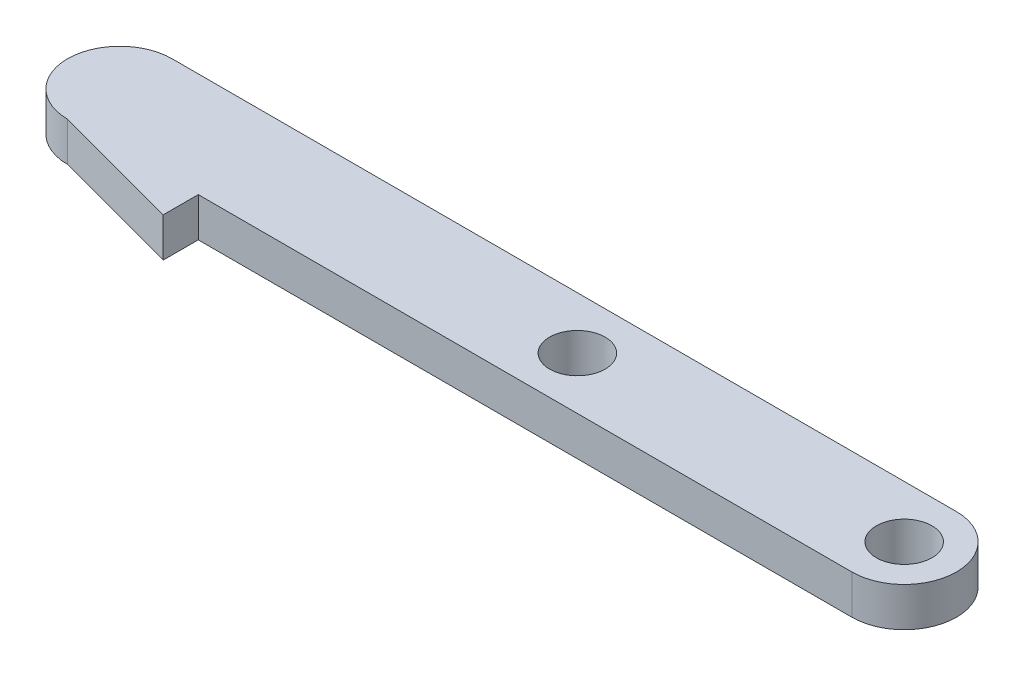
ISO-10303-21;
HEADER;
FILE_DESCRIPTION(('STEP AP214'),'2;1');
FILE_NAME('part.step','',(''),(''),'','','');
FILE_SCHEMA(('AUTOMOTIVE_DESIGN { 1 0 10303 214 1 1 1 1 }'));
ENDSEC;
DATA;
#1=APPLICATION_CONTEXT('core data for automotive mechanical design processes');
#2=APPLICATION_PROTOCOL_DEFINITION('international standard','automotive_design',2000,#1);
#3=PRODUCT_CONTEXT('',#1,'mechanical');
#4=PRODUCT('Part','Part','',(#3));
#5=PRODUCT_RELATED_PRODUCT_CATEGORY('part','',(#4));
#6=PRODUCT_DEFINITION_FORMATION('','',#4);
#7=PRODUCT_DEFINITION_CONTEXT('part definition',#1,'design');
#8=PRODUCT_DEFINITION('design','',#6,#7);
#9=PRODUCT_DEFINITION_SHAPE('','',#8);
#10=(LENGTH_UNIT() NAMED_UNIT(*) SI_UNIT(.MILLI.,.METRE.));
#11=(NAMED_UNIT(*) PLANE_ANGLE_UNIT() SI_UNIT($,.RADIAN.));
#12=(NAMED_UNIT(*) SI_UNIT($,.STERADIAN.) SOLID_ANGLE_UNIT());
#13=UNCERTAINTY_MEASURE_WITH_UNIT(LENGTH_MEASURE(1.E-05),#10,'distance_accuracy_value','');
#14=(GEOMETRIC_REPRESENTATION_CONTEXT(3) GLOBAL_UNCERTAINTY_ASSIGNED_CONTEXT((#13)) GLOBAL_UNIT_ASSIGNED_CONTEXT((#10,
#11,#12)) REPRESENTATION_CONTEXT('',''));
#15=CARTESIAN_POINT('',(0.,0.,0.));
#16=DIRECTION('',(0.,0.,1.));
#17=DIRECTION('',(1.,0.,0.));
#18=AXIS2_PLACEMENT_3D('',#15,#16,#17);
#19=CARTESIAN_POINT('',(-30.,3.,0.));
#20=DIRECTION('',(0.,1.,0.));
#21=DIRECTION('',(0.,0.,1.));
#22=AXIS2_PLACEMENT_3D('',#19,#20,#21);
#23=PLANE('',#22);
#24=CARTESIAN_POINT('',(30.,3.,0.));
#25=DIRECTION('',(0.,1.,0.));
#26=DIRECTION('',(0.,0.,1.));
#27=AXIS2_PLACEMENT_3D('',#24,#25,#26);
#28=CIRCLE('',#27,2.125);
#29=CARTESIAN_POINT('',(30.,3.,2.12499999999999));
#30=VERTEX_POINT('',#29);
#31=EDGE_CURVE('E124',#30,#30,#28,.T.);
#32=ORIENTED_EDGE('',*,*,#31,.F.);
#33=EDGE_LOOP('',(#32));
#34=FACE_BOUND('',#33,.T.);
#35=CARTESIAN_POINT('',(-30.,3.,0.));
#36=DIRECTION('',(0.,1.,0.));
#37=DIRECTION('',(0.,0.,1.));
#38=AXIS2_PLACEMENT_3D('',#35,#36,#37);
#39=CIRCLE('',#38,4.);
#40=CARTESIAN_POINT('',(-30.,3.,-4.));
#41=VERTEX_POINT('',#40);
#42=CARTESIAN_POINT('',(-30.,3.,4.));
#43=VERTEX_POINT('',#42);
#44=EDGE_CURVE('E82',#41,#43,#39,.T.);
#45=ORIENTED_EDGE('',*,*,#44,.T.);
#46=DIRECTION('',(-0.96592582628907,0.,-0.258819045102515));
#47=VECTOR('',#46,1.);
#48=CARTESIAN_POINT('',(-30.,3.,4.));
#49=LINE('',#48,#47);
#50=CARTESIAN_POINT('',(-20.,3.,6.67949192431116));
#51=VERTEX_POINT('',#50);
#52=EDGE_CURVE('E98',#51,#43,#49,.T.);
#53=ORIENTED_EDGE('',*,*,#52,.F.);
#54=DIRECTION('',(0.,0.,1.));
#55=VECTOR('',#54,1.);
#56=CARTESIAN_POINT('',(-20.,3.,6.67949192431116));
#57=LINE('',#56,#55);
#58=CARTESIAN_POINT('',(-20.,3.,4.));
#59=VERTEX_POINT('',#58);
#60=EDGE_CURVE('E108',#59,#51,#57,.T.);
#61=ORIENTED_EDGE('',*,*,#60,.F.);
#62=DIRECTION('',(1.,0.,0.));
#63=VECTOR('',#62,1.);
#64=CARTESIAN_POINT('',(-30.,3.,4.));
#65=LINE('',#64,#63);
#66=CARTESIAN_POINT('',(30.,3.,3.99999999999999));
#67=VERTEX_POINT('',#66);
#68=EDGE_CURVE('E47',#59,#67,#65,.T.);
#69=ORIENTED_EDGE('',*,*,#68,.T.);
#70=CARTESIAN_POINT('',(30.,3.,0.));
#71=DIRECTION('',(0.,1.,0.));
#72=DIRECTION('',(0.,0.,1.));
#73=AXIS2_PLACEMENT_3D('',#70,#71,#72);
#74=CIRCLE('',#73,4.);
#75=CARTESIAN_POINT('',(30.,3.,-4.00000000000001));
#76=VERTEX_POINT('',#75);
#77=EDGE_CURVE('E132',#67,#76,#74,.T.);
#78=ORIENTED_EDGE('',*,*,#77,.T.);
#79=DIRECTION('',(-1.,0.,0.));
#80=VECTOR('',#79,1.);
#81=CARTESIAN_POINT('',(-30.,3.,-4.));
#82=LINE('',#81,#80);
#83=EDGE_CURVE('E56',#76,#41,#82,.T.);
#84=ORIENTED_EDGE('',*,*,#83,.T.);
#85=EDGE_LOOP('',(#45,#53,#61,#69,#78,#84));
#86=FACE_BOUND('',#85,.T.);
#87=CARTESIAN_POINT('',(5.,3.,0.));
#88=DIRECTION('',(0.,1.,0.));
#89=DIRECTION('',(0.,0.,1.));
#90=AXIS2_PLACEMENT_3D('',#87,#88,#89);
#91=CIRCLE('',#90,2.125);
#92=CARTESIAN_POINT('',(5.,3.,2.125));
#93=VERTEX_POINT('',#92);
#94=EDGE_CURVE('E118',#93,#93,#91,.T.);
#95=ORIENTED_EDGE('',*,*,#94,.F.);
#96=EDGE_LOOP('',(#95));
#97=FACE_BOUND('',#96,.T.);
#98=ADVANCED_FACE('F32',(#34,#86,#97),#23,.T.);
#99=CARTESIAN_POINT('',(-30.,0.,0.));
#100=DIRECTION('',(0.,1.,0.));
#101=DIRECTION('',(0.,0.,1.));
#102=AXIS2_PLACEMENT_3D('',#99,#100,#101);
#103=PLANE('',#102);
#104=CARTESIAN_POINT('',(-30.,0.,0.));
#105=DIRECTION('',(0.,1.,0.));
#106=DIRECTION('',(0.,0.,1.));
#107=AXIS2_PLACEMENT_3D('',#104,#105,#106);
#108=CIRCLE('',#107,4.);
#109=CARTESIAN_POINT('',(-30.,0.,-4.));
#110=VERTEX_POINT('',#109);
#111=CARTESIAN_POINT('',(-30.,0.,4.));
#112=VERTEX_POINT('',#111);
#113=EDGE_CURVE('E127',#110,#112,#108,.T.);
#114=ORIENTED_EDGE('',*,*,#113,.F.);
#115=DIRECTION('',(-1.,0.,0.));
#116=VECTOR('',#115,1.);
#117=CARTESIAN_POINT('',(-30.,0.,-4.));
#118=LINE('',#117,#116);
#119=CARTESIAN_POINT('',(30.,0.,-4.00000000000001));
#120=VERTEX_POINT('',#119);
#121=EDGE_CURVE('E77',#120,#110,#118,.T.);
#122=ORIENTED_EDGE('',*,*,#121,.F.);
#123=CARTESIAN_POINT('',(30.,0.,0.));
#124=DIRECTION('',(0.,1.,0.));
#125=DIRECTION('',(0.,0.,1.));
#126=AXIS2_PLACEMENT_3D('',#123,#124,#125);
#127=CIRCLE('',#126,4.);
#128=CARTESIAN_POINT('',(30.,0.,3.99999999999999));
#129=VERTEX_POINT('',#128);
#130=EDGE_CURVE('E139',#129,#120,#127,.T.);
#131=ORIENTED_EDGE('',*,*,#130,.F.);
#132=DIRECTION('',(1.,0.,0.));
#133=VECTOR('',#132,1.);
#134=CARTESIAN_POINT('',(-30.,0.,4.));
#135=LINE('',#134,#133);
#136=CARTESIAN_POINT('',(-20.,0.,4.));
#137=VERTEX_POINT('',#136);
#138=EDGE_CURVE('E137',#137,#129,#135,.T.);
#139=ORIENTED_EDGE('',*,*,#138,.F.);
#140=DIRECTION('',(0.,0.,1.));
#141=VECTOR('',#140,1.);
#142=CARTESIAN_POINT('',(-20.,0.,6.67949192431116));
#143=LINE('',#142,#141);
#144=CARTESIAN_POINT('',(-20.,0.,6.67949192431116));
#145=VERTEX_POINT('',#144);
#146=EDGE_CURVE('E115',#137,#145,#143,.T.);
#147=ORIENTED_EDGE('',*,*,#146,.T.);
#148=DIRECTION('',(-0.96592582628907,0.,-0.258819045102515));
#149=VECTOR('',#148,1.);
#150=CARTESIAN_POINT('',(-30.,0.,4.));
#151=LINE('',#150,#149);
#152=EDGE_CURVE('E100',#145,#112,#151,.T.);
#153=ORIENTED_EDGE('',*,*,#152,.T.);
#154=EDGE_LOOP('',(#114,#122,#131,#139,#147,#153));
#155=FACE_BOUND('',#154,.T.);
#156=CARTESIAN_POINT('',(30.,0.,0.));
#157=DIRECTION('',(0.,1.,0.));
#158=DIRECTION('',(0.,0.,1.));
#159=AXIS2_PLACEMENT_3D('',#156,#157,#158);
#160=CIRCLE('',#159,2.125);
#161=CARTESIAN_POINT('',(30.,0.,2.12499999999999));
#162=VERTEX_POINT('',#161);
#163=EDGE_CURVE('E121',#162,#162,#160,.T.);
#164=ORIENTED_EDGE('',*,*,#163,.T.);
#165=EDGE_LOOP('',(#164));
#166=FACE_BOUND('',#165,.T.);
#167=CARTESIAN_POINT('',(5.,0.,0.));
#168=DIRECTION('',(0.,1.,0.));
#169=DIRECTION('',(0.,0.,1.));
#170=AXIS2_PLACEMENT_3D('',#167,#168,#169);
#171=CIRCLE('',#170,2.125);
#172=CARTESIAN_POINT('',(5.,0.,2.125));
#173=VERTEX_POINT('',#172);
#174=EDGE_CURVE('E104',#173,#173,#171,.T.);
#175=ORIENTED_EDGE('',*,*,#174,.T.);
#176=EDGE_LOOP('',(#175));
#177=FACE_BOUND('',#176,.T.);
#178=ADVANCED_FACE('F152',(#155,#166,#177),#103,.F.);
#179=CARTESIAN_POINT('',(-30.,3.,0.));
#180=DIRECTION('',(0.,-1.,0.));
#181=DIRECTION('',(0.,0.,-1.));
#182=AXIS2_PLACEMENT_3D('',#179,#180,#181);
#183=CYLINDRICAL_SURFACE('',#182,4.);
#184=ORIENTED_EDGE('',*,*,#113,.T.);
#185=DIRECTION('',(0.,-1.,0.));
#186=VECTOR('',#185,1.);
#187=CARTESIAN_POINT('',(-30.,3.,4.));
#188=LINE('',#187,#186);
#189=EDGE_CURVE('E11',#43,#112,#188,.T.);
#190=ORIENTED_EDGE('',*,*,#189,.F.);
#191=ORIENTED_EDGE('',*,*,#44,.F.);
#192=DIRECTION('',(0.,-1.,0.));
#193=VECTOR('',#192,1.);
#194=CARTESIAN_POINT('',(-30.,3.,-4.));
#195=LINE('',#194,#193);
#196=EDGE_CURVE('E135',#41,#110,#195,.T.);
#197=ORIENTED_EDGE('',*,*,#196,.T.);
#198=EDGE_LOOP('',(#184,#190,#191,#197));
#199=FACE_BOUND('',#198,.T.);
#200=ADVANCED_FACE('F34',(#199),#183,.T.);
#201=CARTESIAN_POINT('',(-30.,3.,4.));
#202=DIRECTION('',(0.,0.,-1.));
#203=DIRECTION('',(-1.,0.,0.));
#204=AXIS2_PLACEMENT_3D('',#201,#202,#203);
#205=PLANE('',#204);
#206=ORIENTED_EDGE('',*,*,#68,.F.);
#207=DIRECTION('',(0.,-1.,0.));
#208=VECTOR('',#207,1.);
#209=CARTESIAN_POINT('',(-20.,3.,4.));
#210=LINE('',#209,#208);
#211=EDGE_CURVE('E105',#59,#137,#210,.T.);
#212=ORIENTED_EDGE('',*,*,#211,.T.);
#213=ORIENTED_EDGE('',*,*,#138,.T.);
#214=DIRECTION('',(0.,-1.,0.));
#215=VECTOR('',#214,1.);
#216=CARTESIAN_POINT('',(30.,3.,3.99999999999999));
#217=LINE('',#216,#215);
#218=EDGE_CURVE('E40',#67,#129,#217,.T.);
#219=ORIENTED_EDGE('',*,*,#218,.F.);
#220=EDGE_LOOP('',(#206,#212,#213,#219));
#221=FACE_BOUND('',#220,.T.);
#222=ADVANCED_FACE('F166',(#221),#205,.F.);
#223=CARTESIAN_POINT('',(30.,3.,0.));
#224=DIRECTION('',(0.,-1.,0.));
#225=DIRECTION('',(0.,0.,-1.));
#226=AXIS2_PLACEMENT_3D('',#223,#224,#225);
#227=CYLINDRICAL_SURFACE('',#226,4.);
#228=ORIENTED_EDGE('',*,*,#130,.T.);
#229=DIRECTION('',(0.,-1.,0.));
#230=VECTOR('',#229,1.);
#231=CARTESIAN_POINT('',(30.,3.,-4.00000000000001));
#232=LINE('',#231,#230);
#233=EDGE_CURVE('E143',#76,#120,#232,.T.);
#234=ORIENTED_EDGE('',*,*,#233,.F.);
#235=ORIENTED_EDGE('',*,*,#77,.F.);
#236=ORIENTED_EDGE('',*,*,#218,.T.);
#237=EDGE_LOOP('',(#228,#234,#235,#236));
#238=FACE_BOUND('',#237,.T.);
#239=ADVANCED_FACE('F148',(#238),#227,.T.);
#240=CARTESIAN_POINT('',(-30.,3.,-4.));
#241=DIRECTION('',(0.,0.,1.));
#242=DIRECTION('',(1.,0.,0.));
#243=AXIS2_PLACEMENT_3D('',#240,#241,#242);
#244=PLANE('',#243);
#245=ORIENTED_EDGE('',*,*,#121,.T.);
#246=ORIENTED_EDGE('',*,*,#196,.F.);
#247=ORIENTED_EDGE('',*,*,#83,.F.);
#248=ORIENTED_EDGE('',*,*,#233,.T.);
#249=EDGE_LOOP('',(#245,#246,#247,#248));
#250=FACE_BOUND('',#249,.T.);
#251=ADVANCED_FACE('F155',(#250),#244,.F.);
#252=CARTESIAN_POINT('',(30.,3.,0.));
#253=DIRECTION('',(0.,-1.,0.));
#254=DIRECTION('',(0.,0.,-1.));
#255=AXIS2_PLACEMENT_3D('',#252,#253,#254);
#256=CYLINDRICAL_SURFACE('',#255,2.125);
#257=ORIENTED_EDGE('',*,*,#31,.T.);
#258=EDGE_LOOP('',(#257));
#259=FACE_BOUND('',#258,.T.);
#260=ORIENTED_EDGE('',*,*,#163,.F.);
#261=EDGE_LOOP('',(#260));
#262=FACE_BOUND('',#261,.T.);
#263=ADVANCED_FACE('F157',(#259,#262),#256,.F.);
#264=CARTESIAN_POINT('',(5.,3.,0.));
#265=DIRECTION('',(0.,-1.,0.));
#266=DIRECTION('',(0.,0.,-1.));
#267=AXIS2_PLACEMENT_3D('',#264,#265,#266);
#268=CYLINDRICAL_SURFACE('',#267,2.125);
#269=ORIENTED_EDGE('',*,*,#94,.T.);
#270=EDGE_LOOP('',(#269));
#271=FACE_BOUND('',#270,.T.);
#272=ORIENTED_EDGE('',*,*,#174,.F.);
#273=EDGE_LOOP('',(#272));
#274=FACE_BOUND('',#273,.T.);
#275=ADVANCED_FACE('F163',(#271,#274),#268,.F.);
#276=CARTESIAN_POINT('',(-30.,3.,4.));
#277=DIRECTION('',(-0.258819045102515,0.,0.96592582628907));
#278=DIRECTION('',(0.96592582628907,0.,0.258819045102515));
#279=AXIS2_PLACEMENT_3D('',#276,#277,#278);
#280=PLANE('',#279);
#281=ORIENTED_EDGE('',*,*,#152,.F.);
#282=DIRECTION('',(0.,-1.,0.));
#283=VECTOR('',#282,1.);
#284=CARTESIAN_POINT('',(-20.,3.,6.67949192431116));
#285=LINE('',#284,#283);
#286=EDGE_CURVE('E95',#51,#145,#285,.T.);
#287=ORIENTED_EDGE('',*,*,#286,.F.);
#288=ORIENTED_EDGE('',*,*,#52,.T.);
#289=ORIENTED_EDGE('',*,*,#189,.T.);
#290=EDGE_LOOP('',(#281,#287,#288,#289));
#291=FACE_BOUND('',#290,.T.);
#292=ADVANCED_FACE('F97',(#291),#280,.T.);
#293=CARTESIAN_POINT('',(-20.,3.,6.67949192431116));
#294=DIRECTION('',(1.,0.,0.));
#295=DIRECTION('',(0.,0.,-1.));
#296=AXIS2_PLACEMENT_3D('',#293,#294,#295);
#297=PLANE('',#296);
#298=ORIENTED_EDGE('',*,*,#146,.F.);
#299=ORIENTED_EDGE('',*,*,#211,.F.);
#300=ORIENTED_EDGE('',*,*,#60,.T.);
#301=ORIENTED_EDGE('',*,*,#286,.T.);
#302=EDGE_LOOP('',(#298,#299,#300,#301));
#303=FACE_BOUND('',#302,.T.);
#304=ADVANCED_FACE('F109',(#303),#297,.T.);
#305=CLOSED_SHELL('',(#98,#178,#200,#222,#239,#251,#263,#275,#292,#304));
#306=MANIFOLD_SOLID_BREP('B2',#305);
#307=ADVANCED_BREP_SHAPE_REPRESENTATION('',(#18,#306),#14);
#308=SHAPE_DEFINITION_REPRESENTATION(#9,#307);
ENDSEC;
END-ISO-10303-21;
